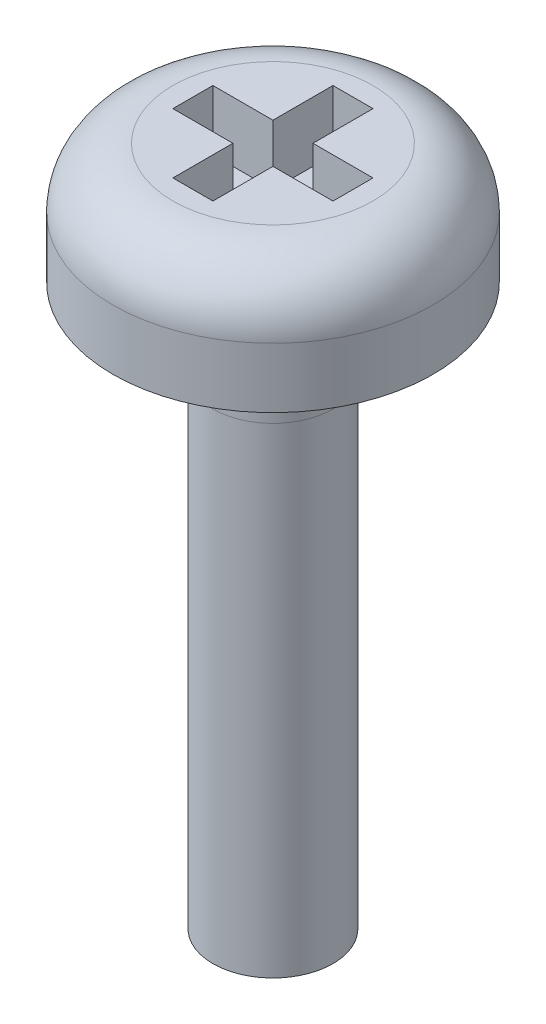
ISO-10303-21;
HEADER;
FILE_DESCRIPTION(('STEP AP214'),'2;1');
FILE_NAME('part.step','',(''),(''),'','','');
FILE_SCHEMA(('AUTOMOTIVE_DESIGN { 1 0 10303 214 1 1 1 1 }'));
ENDSEC;
DATA;
#1=APPLICATION_CONTEXT('core data for automotive mechanical design processes');
#2=APPLICATION_PROTOCOL_DEFINITION('international standard','automotive_design',2000,#1);
#3=PRODUCT_CONTEXT('',#1,'mechanical');
#4=PRODUCT('Part','Part','',(#3));
#5=PRODUCT_RELATED_PRODUCT_CATEGORY('part','',(#4));
#6=PRODUCT_DEFINITION_FORMATION('','',#4);
#7=PRODUCT_DEFINITION_CONTEXT('part definition',#1,'design');
#8=PRODUCT_DEFINITION('design','',#6,#7);
#9=PRODUCT_DEFINITION_SHAPE('','',#8);
#10=(LENGTH_UNIT() NAMED_UNIT(*) SI_UNIT(.MILLI.,.METRE.));
#11=(NAMED_UNIT(*) PLANE_ANGLE_UNIT() SI_UNIT($,.RADIAN.));
#12=(NAMED_UNIT(*) SI_UNIT($,.STERADIAN.) SOLID_ANGLE_UNIT());
#13=UNCERTAINTY_MEASURE_WITH_UNIT(LENGTH_MEASURE(1.E-05),#10,'distance_accuracy_value','');
#14=(GEOMETRIC_REPRESENTATION_CONTEXT(3) GLOBAL_UNCERTAINTY_ASSIGNED_CONTEXT((#13)) GLOBAL_UNIT_ASSIGNED_CONTEXT((#10,
#11,#12)) REPRESENTATION_CONTEXT('',''));
#15=CARTESIAN_POINT('',(0.,0.,0.));
#16=DIRECTION('',(0.,0.,1.));
#17=DIRECTION('',(1.,0.,0.));
#18=AXIS2_PLACEMENT_3D('',#15,#16,#17);
#19=CARTESIAN_POINT('',(0.,7.,0.));
#20=DIRECTION('',(0.,-1.,0.));
#21=DIRECTION('',(0.,0.,-1.));
#22=AXIS2_PLACEMENT_3D('',#19,#20,#21);
#23=CYLINDRICAL_SURFACE('',#22,0.75);
#24=CARTESIAN_POINT('',(0.,0.,0.));
#25=DIRECTION('',(0.,1.,0.));
#26=DIRECTION('',(0.,0.,1.));
#27=AXIS2_PLACEMENT_3D('',#24,#25,#26);
#28=CIRCLE('',#27,0.75);
#29=CARTESIAN_POINT('',(0.,0.,0.75));
#30=VERTEX_POINT('',#29);
#31=EDGE_CURVE('E214',#30,#30,#28,.T.);
#32=ORIENTED_EDGE('',*,*,#31,.T.);
#33=EDGE_LOOP('',(#32));
#34=FACE_BOUND('',#33,.T.);
#35=CARTESIAN_POINT('',(0.,6.,0.));
#36=DIRECTION('',(0.,1.,0.));
#37=DIRECTION('',(0.,0.,1.));
#38=AXIS2_PLACEMENT_3D('',#35,#36,#37);
#39=CIRCLE('',#38,0.75);
#40=CARTESIAN_POINT('',(0.,6.,0.75));
#41=VERTEX_POINT('',#40);
#42=EDGE_CURVE('E11',#41,#41,#39,.T.);
#43=ORIENTED_EDGE('',*,*,#42,.F.);
#44=EDGE_LOOP('',(#43));
#45=FACE_BOUND('',#44,.T.);
#46=ADVANCED_FACE('F37',(#34,#45),#23,.T.);
#47=ORIENTED_EDGE('',*,*,#42,.T.);
#48=EDGE_LOOP('',(#47));
#49=FACE_BOUND('',#48,.T.);
#50=CARTESIAN_POINT('',(0.,7.,0.));
#51=DIRECTION('',(0.,1.,0.));
#52=DIRECTION('',(0.,0.,1.));
#53=AXIS2_PLACEMENT_3D('',#50,#51,#52);
#54=CIRCLE('',#53,0.75);
#55=CARTESIAN_POINT('',(0.,7.,0.75));
#56=VERTEX_POINT('',#55);
#57=EDGE_CURVE('E215',#56,#56,#54,.T.);
#58=ORIENTED_EDGE('',*,*,#57,.F.);
#59=EDGE_LOOP('',(#58));
#60=FACE_BOUND('',#59,.T.);
#61=ADVANCED_FACE('F248',(#49,#60),#23,.T.);
#62=CARTESIAN_POINT('',(0.,0.,0.));
#63=DIRECTION('',(0.,1.,0.));
#64=DIRECTION('',(0.,0.,1.));
#65=AXIS2_PLACEMENT_3D('',#62,#63,#64);
#66=PLANE('',#65);
#67=ORIENTED_EDGE('',*,*,#31,.F.);
#68=EDGE_LOOP('',(#67));
#69=FACE_BOUND('',#68,.T.);
#70=ADVANCED_FACE('F244',(#69),#66,.F.);
#71=CARTESIAN_POINT('',(0.,8.5,0.));
#72=DIRECTION('',(0.,-1.,0.));
#73=DIRECTION('',(0.,0.,-1.));
#74=AXIS2_PLACEMENT_3D('',#71,#72,#73);
#75=CYLINDRICAL_SURFACE('',#74,2.);
#76=CARTESIAN_POINT('',(0.,7.75,0.));
#77=DIRECTION('',(0.,1.,0.));
#78=DIRECTION('',(0.,0.,1.));
#79=AXIS2_PLACEMENT_3D('',#76,#77,#78);
#80=CIRCLE('',#79,2.);
#81=CARTESIAN_POINT('',(0.,7.75,2.));
#82=VERTEX_POINT('',#81);
#83=EDGE_CURVE('E46',#82,#82,#80,.F.);
#84=ORIENTED_EDGE('',*,*,#83,.T.);
#85=EDGE_LOOP('',(#84));
#86=FACE_BOUND('',#85,.T.);
#87=CARTESIAN_POINT('',(0.,7.,0.));
#88=DIRECTION('',(0.,1.,0.));
#89=DIRECTION('',(0.,0.,1.));
#90=AXIS2_PLACEMENT_3D('',#87,#88,#89);
#91=CIRCLE('',#90,2.);
#92=CARTESIAN_POINT('',(0.,7.,2.));
#93=VERTEX_POINT('',#92);
#94=EDGE_CURVE('E194',#93,#93,#91,.T.);
#95=ORIENTED_EDGE('',*,*,#94,.T.);
#96=EDGE_LOOP('',(#95));
#97=FACE_BOUND('',#96,.T.);
#98=ADVANCED_FACE('F225',(#86,#97),#75,.T.);
#99=CARTESIAN_POINT('',(0.,8.5,0.));
#100=DIRECTION('',(0.,1.,0.));
#101=DIRECTION('',(0.,0.,1.));
#102=AXIS2_PLACEMENT_3D('',#99,#100,#101);
#103=PLANE('',#102);
#104=DIRECTION('',(0.,0.,-1.));
#105=VECTOR('',#104,1.);
#106=CARTESIAN_POINT('',(0.25,8.5,0.25));
#107=LINE('',#106,#105);
#108=CARTESIAN_POINT('',(0.25,8.5,1.));
#109=VERTEX_POINT('',#108);
#110=CARTESIAN_POINT('',(0.25,8.5,0.25));
#111=VERTEX_POINT('',#110);
#112=EDGE_CURVE('E53',#109,#111,#107,.T.);
#113=ORIENTED_EDGE('',*,*,#112,.F.);
#114=DIRECTION('',(1.,0.,0.));
#115=VECTOR('',#114,1.);
#116=CARTESIAN_POINT('',(-0.25,8.5,1.));
#117=LINE('',#116,#115);
#118=CARTESIAN_POINT('',(-0.25,8.5,1.));
#119=VERTEX_POINT('',#118);
#120=EDGE_CURVE('E190',#119,#109,#117,.T.);
#121=ORIENTED_EDGE('',*,*,#120,.F.);
#122=DIRECTION('',(0.,0.,1.));
#123=VECTOR('',#122,1.);
#124=CARTESIAN_POINT('',(-0.25,8.5,0.25));
#125=LINE('',#124,#123);
#126=CARTESIAN_POINT('',(-0.25,8.5,0.25));
#127=VERTEX_POINT('',#126);
#128=EDGE_CURVE('E188',#127,#119,#125,.T.);
#129=ORIENTED_EDGE('',*,*,#128,.F.);
#130=DIRECTION('',(1.,0.,0.));
#131=VECTOR('',#130,1.);
#132=CARTESIAN_POINT('',(-1.,8.5,0.25));
#133=LINE('',#132,#131);
#134=CARTESIAN_POINT('',(-1.,8.5,0.25));
#135=VERTEX_POINT('',#134);
#136=EDGE_CURVE('E137',#135,#127,#133,.T.);
#137=ORIENTED_EDGE('',*,*,#136,.F.);
#138=DIRECTION('',(0.,0.,1.));
#139=VECTOR('',#138,1.);
#140=CARTESIAN_POINT('',(-1.,8.5,-0.25));
#141=LINE('',#140,#139);
#142=CARTESIAN_POINT('',(-1.,8.5,-0.25));
#143=VERTEX_POINT('',#142);
#144=EDGE_CURVE('E184',#143,#135,#141,.T.);
#145=ORIENTED_EDGE('',*,*,#144,.F.);
#146=DIRECTION('',(-1.,0.,0.));
#147=VECTOR('',#146,1.);
#148=CARTESIAN_POINT('',(-1.,8.5,-0.25));
#149=LINE('',#148,#147);
#150=CARTESIAN_POINT('',(-0.25,8.5,-0.25));
#151=VERTEX_POINT('',#150);
#152=EDGE_CURVE('E181',#151,#143,#149,.T.);
#153=ORIENTED_EDGE('',*,*,#152,.F.);
#154=DIRECTION('',(0.,0.,1.));
#155=VECTOR('',#154,1.);
#156=CARTESIAN_POINT('',(-0.25,8.5,-1.));
#157=LINE('',#156,#155);
#158=CARTESIAN_POINT('',(-0.25,8.5,-1.));
#159=VERTEX_POINT('',#158);
#160=EDGE_CURVE('E178',#159,#151,#157,.T.);
#161=ORIENTED_EDGE('',*,*,#160,.F.);
#162=DIRECTION('',(-1.,0.,0.));
#163=VECTOR('',#162,1.);
#164=CARTESIAN_POINT('',(-0.25,8.5,-1.));
#165=LINE('',#164,#163);
#166=CARTESIAN_POINT('',(0.25,8.5,-1.));
#167=VERTEX_POINT('',#166);
#168=EDGE_CURVE('E175',#167,#159,#165,.T.);
#169=ORIENTED_EDGE('',*,*,#168,.F.);
#170=DIRECTION('',(0.,0.,-1.));
#171=VECTOR('',#170,1.);
#172=CARTESIAN_POINT('',(0.25,8.5,-1.));
#173=LINE('',#172,#171);
#174=CARTESIAN_POINT('',(0.25,8.5,-0.25));
#175=VERTEX_POINT('',#174);
#176=EDGE_CURVE('E172',#175,#167,#173,.T.);
#177=ORIENTED_EDGE('',*,*,#176,.F.);
#178=DIRECTION('',(-1.,0.,0.));
#179=VECTOR('',#178,1.);
#180=CARTESIAN_POINT('',(0.25,8.5,-0.25));
#181=LINE('',#180,#179);
#182=CARTESIAN_POINT('',(1.,8.5,-0.25));
#183=VERTEX_POINT('',#182);
#184=EDGE_CURVE('E169',#183,#175,#181,.T.);
#185=ORIENTED_EDGE('',*,*,#184,.F.);
#186=DIRECTION('',(0.,0.,-1.));
#187=VECTOR('',#186,1.);
#188=CARTESIAN_POINT('',(1.,8.5,-0.25));
#189=LINE('',#188,#187);
#190=CARTESIAN_POINT('',(1.,8.5,0.25));
#191=VERTEX_POINT('',#190);
#192=EDGE_CURVE('E166',#191,#183,#189,.T.);
#193=ORIENTED_EDGE('',*,*,#192,.F.);
#194=DIRECTION('',(1.,0.,0.));
#195=VECTOR('',#194,1.);
#196=CARTESIAN_POINT('',(0.25,8.5,0.25));
#197=LINE('',#196,#195);
#198=EDGE_CURVE('E163',#111,#191,#197,.T.);
#199=ORIENTED_EDGE('',*,*,#198,.F.);
#200=EDGE_LOOP('',(#113,#121,#129,#137,#145,#153,#161,#169,#177,#185,#193,#199));
#201=FACE_BOUND('',#200,.T.);
#202=CARTESIAN_POINT('',(0.,8.5,0.));
#203=DIRECTION('',(0.,1.,0.));
#204=DIRECTION('',(0.,0.,1.));
#205=AXIS2_PLACEMENT_3D('',#202,#203,#204);
#206=CIRCLE('',#205,1.25);
#207=CARTESIAN_POINT('',(0.,8.5,1.25));
#208=VERTEX_POINT('',#207);
#209=EDGE_CURVE('E218',#208,#208,#206,.T.);
#210=ORIENTED_EDGE('',*,*,#209,.T.);
#211=EDGE_LOOP('',(#210));
#212=FACE_BOUND('',#211,.T.);
#213=ADVANCED_FACE('F234',(#201,#212),#103,.T.);
#214=CARTESIAN_POINT('',(0.,7.,0.));
#215=DIRECTION('',(0.,1.,0.));
#216=DIRECTION('',(0.,0.,1.));
#217=AXIS2_PLACEMENT_3D('',#214,#215,#216);
#218=PLANE('',#217);
#219=ORIENTED_EDGE('',*,*,#57,.T.);
#220=EDGE_LOOP('',(#219));
#221=FACE_BOUND('',#220,.T.);
#222=ORIENTED_EDGE('',*,*,#94,.F.);
#223=EDGE_LOOP('',(#222));
#224=FACE_BOUND('',#223,.T.);
#225=ADVANCED_FACE('F231',(#221,#224),#218,.F.);
#226=CARTESIAN_POINT('',(0.,7.75,0.));
#227=DIRECTION('',(0.,1.,0.));
#228=DIRECTION('',(0.,0.,1.));
#229=AXIS2_PLACEMENT_3D('',#226,#227,#228);
#230=TOROIDAL_SURFACE('',#229,1.25,0.75);
#231=ORIENTED_EDGE('',*,*,#83,.F.);
#232=EDGE_LOOP('',(#231));
#233=FACE_BOUND('',#232,.T.);
#234=ORIENTED_EDGE('',*,*,#209,.F.);
#235=EDGE_LOOP('',(#234));
#236=FACE_BOUND('',#235,.T.);
#237=ADVANCED_FACE('F39',(#233,#236),#230,.T.);
#238=CARTESIAN_POINT('',(0.25,7.75,0.25));
#239=DIRECTION('',(1.,0.,0.));
#240=DIRECTION('',(0.,0.,-1.));
#241=AXIS2_PLACEMENT_3D('',#238,#239,#240);
#242=PLANE('',#241);
#243=ORIENTED_EDGE('',*,*,#112,.T.);
#244=DIRECTION('',(0.,1.,0.));
#245=VECTOR('',#244,1.);
#246=CARTESIAN_POINT('',(0.25,7.75,0.25));
#247=LINE('',#246,#245);
#248=CARTESIAN_POINT('',(0.25,7.75,0.25));
#249=VERTEX_POINT('',#248);
#250=EDGE_CURVE('E101',#249,#111,#247,.T.);
#251=ORIENTED_EDGE('',*,*,#250,.F.);
#252=DIRECTION('',(0.,0.,-1.));
#253=VECTOR('',#252,1.);
#254=CARTESIAN_POINT('',(0.25,7.75,0.25));
#255=LINE('',#254,#253);
#256=CARTESIAN_POINT('',(0.25,7.75,1.));
#257=VERTEX_POINT('',#256);
#258=EDGE_CURVE('E192',#257,#249,#255,.T.);
#259=ORIENTED_EDGE('',*,*,#258,.F.);
#260=DIRECTION('',(0.,1.,0.));
#261=VECTOR('',#260,1.);
#262=CARTESIAN_POINT('',(0.25,7.75,1.));
#263=LINE('',#262,#261);
#264=EDGE_CURVE('E61',#257,#109,#263,.T.);
#265=ORIENTED_EDGE('',*,*,#264,.T.);
#266=EDGE_LOOP('',(#243,#251,#259,#265));
#267=FACE_BOUND('',#266,.T.);
#268=ADVANCED_FACE('F230',(#267),#242,.F.);
#269=CARTESIAN_POINT('',(-0.25,7.75,1.));
#270=DIRECTION('',(0.,0.,1.));
#271=DIRECTION('',(1.,0.,0.));
#272=AXIS2_PLACEMENT_3D('',#269,#270,#271);
#273=PLANE('',#272);
#274=ORIENTED_EDGE('',*,*,#120,.T.);
#275=ORIENTED_EDGE('',*,*,#264,.F.);
#276=DIRECTION('',(1.,0.,0.));
#277=VECTOR('',#276,1.);
#278=CARTESIAN_POINT('',(-0.25,7.75,1.));
#279=LINE('',#278,#277);
#280=CARTESIAN_POINT('',(-0.25,7.75,1.));
#281=VERTEX_POINT('',#280);
#282=EDGE_CURVE('E149',#281,#257,#279,.T.);
#283=ORIENTED_EDGE('',*,*,#282,.F.);
#284=DIRECTION('',(0.,1.,0.));
#285=VECTOR('',#284,1.);
#286=CARTESIAN_POINT('',(-0.25,7.75,1.));
#287=LINE('',#286,#285);
#288=EDGE_CURVE('E141',#281,#119,#287,.T.);
#289=ORIENTED_EDGE('',*,*,#288,.T.);
#290=EDGE_LOOP('',(#274,#275,#283,#289));
#291=FACE_BOUND('',#290,.T.);
#292=ADVANCED_FACE('F289',(#291),#273,.F.);
#293=CARTESIAN_POINT('',(-0.25,7.75,0.25));
#294=DIRECTION('',(-1.,0.,0.));
#295=DIRECTION('',(0.,0.,1.));
#296=AXIS2_PLACEMENT_3D('',#293,#294,#295);
#297=PLANE('',#296);
#298=ORIENTED_EDGE('',*,*,#128,.T.);
#299=ORIENTED_EDGE('',*,*,#288,.F.);
#300=DIRECTION('',(0.,0.,1.));
#301=VECTOR('',#300,1.);
#302=CARTESIAN_POINT('',(-0.25,7.75,0.25));
#303=LINE('',#302,#301);
#304=CARTESIAN_POINT('',(-0.25,7.75,0.25));
#305=VERTEX_POINT('',#304);
#306=EDGE_CURVE('E145',#305,#281,#303,.T.);
#307=ORIENTED_EDGE('',*,*,#306,.F.);
#308=DIRECTION('',(0.,1.,0.));
#309=VECTOR('',#308,1.);
#310=CARTESIAN_POINT('',(-0.25,7.75,0.25));
#311=LINE('',#310,#309);
#312=EDGE_CURVE('E130',#305,#127,#311,.T.);
#313=ORIENTED_EDGE('',*,*,#312,.T.);
#314=EDGE_LOOP('',(#298,#299,#307,#313));
#315=FACE_BOUND('',#314,.T.);
#316=ADVANCED_FACE('F146',(#315),#297,.F.);
#317=CARTESIAN_POINT('',(-1.,7.75,0.25));
#318=DIRECTION('',(0.,0.,1.));
#319=DIRECTION('',(1.,0.,0.));
#320=AXIS2_PLACEMENT_3D('',#317,#318,#319);
#321=PLANE('',#320);
#322=ORIENTED_EDGE('',*,*,#136,.T.);
#323=ORIENTED_EDGE('',*,*,#312,.F.);
#324=DIRECTION('',(1.,0.,0.));
#325=VECTOR('',#324,1.);
#326=CARTESIAN_POINT('',(-1.,7.75,0.25));
#327=LINE('',#326,#325);
#328=CARTESIAN_POINT('',(-1.,7.75,0.25));
#329=VERTEX_POINT('',#328);
#330=EDGE_CURVE('E134',#329,#305,#327,.T.);
#331=ORIENTED_EDGE('',*,*,#330,.F.);
#332=DIRECTION('',(0.,1.,0.));
#333=VECTOR('',#332,1.);
#334=CARTESIAN_POINT('',(-1.,7.75,0.25));
#335=LINE('',#334,#333);
#336=EDGE_CURVE('E142',#329,#135,#335,.T.);
#337=ORIENTED_EDGE('',*,*,#336,.T.);
#338=EDGE_LOOP('',(#322,#323,#331,#337));
#339=FACE_BOUND('',#338,.T.);
#340=ADVANCED_FACE('F132',(#339),#321,.F.);
#341=CARTESIAN_POINT('',(-1.,7.75,-0.25));
#342=DIRECTION('',(-1.,0.,0.));
#343=DIRECTION('',(0.,0.,1.));
#344=AXIS2_PLACEMENT_3D('',#341,#342,#343);
#345=PLANE('',#344);
#346=ORIENTED_EDGE('',*,*,#144,.T.);
#347=ORIENTED_EDGE('',*,*,#336,.F.);
#348=DIRECTION('',(0.,0.,1.));
#349=VECTOR('',#348,1.);
#350=CARTESIAN_POINT('',(-1.,7.75,-0.25));
#351=LINE('',#350,#349);
#352=CARTESIAN_POINT('',(-1.,7.75,-0.25));
#353=VERTEX_POINT('',#352);
#354=EDGE_CURVE('E155',#353,#329,#351,.T.);
#355=ORIENTED_EDGE('',*,*,#354,.F.);
#356=DIRECTION('',(0.,1.,0.));
#357=VECTOR('',#356,1.);
#358=CARTESIAN_POINT('',(-1.,7.75,-0.25));
#359=LINE('',#358,#357);
#360=EDGE_CURVE('E197',#353,#143,#359,.T.);
#361=ORIENTED_EDGE('',*,*,#360,.T.);
#362=EDGE_LOOP('',(#346,#347,#355,#361));
#363=FACE_BOUND('',#362,.T.);
#364=ADVANCED_FACE('F313',(#363),#345,.F.);
#365=CARTESIAN_POINT('',(-1.,7.75,-0.25));
#366=DIRECTION('',(0.,0.,-1.));
#367=DIRECTION('',(-1.,0.,0.));
#368=AXIS2_PLACEMENT_3D('',#365,#366,#367);
#369=PLANE('',#368);
#370=ORIENTED_EDGE('',*,*,#152,.T.);
#371=ORIENTED_EDGE('',*,*,#360,.F.);
#372=DIRECTION('',(-1.,0.,0.));
#373=VECTOR('',#372,1.);
#374=CARTESIAN_POINT('',(-1.,7.75,-0.25));
#375=LINE('',#374,#373);
#376=CARTESIAN_POINT('',(-0.25,7.75,-0.25));
#377=VERTEX_POINT('',#376);
#378=EDGE_CURVE('E157',#377,#353,#375,.T.);
#379=ORIENTED_EDGE('',*,*,#378,.F.);
#380=DIRECTION('',(0.,1.,0.));
#381=VECTOR('',#380,1.);
#382=CARTESIAN_POINT('',(-0.25,7.75,-0.25));
#383=LINE('',#382,#381);
#384=EDGE_CURVE('E199',#377,#151,#383,.T.);
#385=ORIENTED_EDGE('',*,*,#384,.T.);
#386=EDGE_LOOP('',(#370,#371,#379,#385));
#387=FACE_BOUND('',#386,.T.);
#388=ADVANCED_FACE('F322',(#387),#369,.F.);
#389=CARTESIAN_POINT('',(-0.25,7.75,-1.));
#390=DIRECTION('',(-1.,0.,0.));
#391=DIRECTION('',(0.,0.,1.));
#392=AXIS2_PLACEMENT_3D('',#389,#390,#391);
#393=PLANE('',#392);
#394=ORIENTED_EDGE('',*,*,#160,.T.);
#395=ORIENTED_EDGE('',*,*,#384,.F.);
#396=DIRECTION('',(0.,0.,1.));
#397=VECTOR('',#396,1.);
#398=CARTESIAN_POINT('',(-0.25,7.75,-1.));
#399=LINE('',#398,#397);
#400=CARTESIAN_POINT('',(-0.25,7.75,-1.));
#401=VERTEX_POINT('',#400);
#402=EDGE_CURVE('E443',#401,#377,#399,.T.);
#403=ORIENTED_EDGE('',*,*,#402,.F.);
#404=DIRECTION('',(0.,1.,0.));
#405=VECTOR('',#404,1.);
#406=CARTESIAN_POINT('',(-0.25,7.75,-1.));
#407=LINE('',#406,#405);
#408=EDGE_CURVE('E201',#401,#159,#407,.T.);
#409=ORIENTED_EDGE('',*,*,#408,.T.);
#410=EDGE_LOOP('',(#394,#395,#403,#409));
#411=FACE_BOUND('',#410,.T.);
#412=ADVANCED_FACE('F332',(#411),#393,.F.);
#413=CARTESIAN_POINT('',(-0.25,7.75,-1.));
#414=DIRECTION('',(0.,0.,-1.));
#415=DIRECTION('',(-1.,0.,0.));
#416=AXIS2_PLACEMENT_3D('',#413,#414,#415);
#417=PLANE('',#416);
#418=ORIENTED_EDGE('',*,*,#168,.T.);
#419=ORIENTED_EDGE('',*,*,#408,.F.);
#420=DIRECTION('',(-1.,0.,0.));
#421=VECTOR('',#420,1.);
#422=CARTESIAN_POINT('',(-0.25,7.75,-1.));
#423=LINE('',#422,#421);
#424=CARTESIAN_POINT('',(0.25,7.75,-1.));
#425=VERTEX_POINT('',#424);
#426=EDGE_CURVE('E440',#425,#401,#423,.T.);
#427=ORIENTED_EDGE('',*,*,#426,.F.);
#428=DIRECTION('',(0.,1.,0.));
#429=VECTOR('',#428,1.);
#430=CARTESIAN_POINT('',(0.25,7.75,-1.));
#431=LINE('',#430,#429);
#432=EDGE_CURVE('E203',#425,#167,#431,.T.);
#433=ORIENTED_EDGE('',*,*,#432,.T.);
#434=EDGE_LOOP('',(#418,#419,#427,#433));
#435=FACE_BOUND('',#434,.T.);
#436=ADVANCED_FACE('F342',(#435),#417,.F.);
#437=CARTESIAN_POINT('',(0.25,7.75,-1.));
#438=DIRECTION('',(1.,0.,0.));
#439=DIRECTION('',(0.,0.,-1.));
#440=AXIS2_PLACEMENT_3D('',#437,#438,#439);
#441=PLANE('',#440);
#442=ORIENTED_EDGE('',*,*,#176,.T.);
#443=ORIENTED_EDGE('',*,*,#432,.F.);
#444=DIRECTION('',(0.,0.,-1.));
#445=VECTOR('',#444,1.);
#446=CARTESIAN_POINT('',(0.25,7.75,-1.));
#447=LINE('',#446,#445);
#448=CARTESIAN_POINT('',(0.25,7.75,-0.25));
#449=VERTEX_POINT('',#448);
#450=EDGE_CURVE('E437',#449,#425,#447,.T.);
#451=ORIENTED_EDGE('',*,*,#450,.F.);
#452=DIRECTION('',(0.,1.,0.));
#453=VECTOR('',#452,1.);
#454=CARTESIAN_POINT('',(0.25,7.75,-0.25));
#455=LINE('',#454,#453);
#456=EDGE_CURVE('E205',#449,#175,#455,.T.);
#457=ORIENTED_EDGE('',*,*,#456,.T.);
#458=EDGE_LOOP('',(#442,#443,#451,#457));
#459=FACE_BOUND('',#458,.T.);
#460=ADVANCED_FACE('F352',(#459),#441,.F.);
#461=CARTESIAN_POINT('',(0.25,7.75,-0.25));
#462=DIRECTION('',(0.,0.,-1.));
#463=DIRECTION('',(-1.,0.,0.));
#464=AXIS2_PLACEMENT_3D('',#461,#462,#463);
#465=PLANE('',#464);
#466=ORIENTED_EDGE('',*,*,#184,.T.);
#467=ORIENTED_EDGE('',*,*,#456,.F.);
#468=DIRECTION('',(-1.,0.,0.));
#469=VECTOR('',#468,1.);
#470=CARTESIAN_POINT('',(0.25,7.75,-0.25));
#471=LINE('',#470,#469);
#472=CARTESIAN_POINT('',(1.,7.75,-0.25));
#473=VERTEX_POINT('',#472);
#474=EDGE_CURVE('E430',#473,#449,#471,.T.);
#475=ORIENTED_EDGE('',*,*,#474,.F.);
#476=DIRECTION('',(0.,1.,0.));
#477=VECTOR('',#476,1.);
#478=CARTESIAN_POINT('',(1.,7.75,-0.25));
#479=LINE('',#478,#477);
#480=EDGE_CURVE('E207',#473,#183,#479,.T.);
#481=ORIENTED_EDGE('',*,*,#480,.T.);
#482=EDGE_LOOP('',(#466,#467,#475,#481));
#483=FACE_BOUND('',#482,.T.);
#484=ADVANCED_FACE('F362',(#483),#465,.F.);
#485=CARTESIAN_POINT('',(1.,7.75,-0.25));
#486=DIRECTION('',(1.,0.,0.));
#487=DIRECTION('',(0.,0.,-1.));
#488=AXIS2_PLACEMENT_3D('',#485,#486,#487);
#489=PLANE('',#488);
#490=ORIENTED_EDGE('',*,*,#192,.T.);
#491=ORIENTED_EDGE('',*,*,#480,.F.);
#492=DIRECTION('',(0.,0.,-1.));
#493=VECTOR('',#492,1.);
#494=CARTESIAN_POINT('',(1.,7.75,-0.25));
#495=LINE('',#494,#493);
#496=CARTESIAN_POINT('',(1.,7.75,0.25));
#497=VERTEX_POINT('',#496);
#498=EDGE_CURVE('E427',#497,#473,#495,.T.);
#499=ORIENTED_EDGE('',*,*,#498,.F.);
#500=DIRECTION('',(0.,1.,0.));
#501=VECTOR('',#500,1.);
#502=CARTESIAN_POINT('',(1.,7.75,0.25));
#503=LINE('',#502,#501);
#504=EDGE_CURVE('E209',#497,#191,#503,.T.);
#505=ORIENTED_EDGE('',*,*,#504,.T.);
#506=EDGE_LOOP('',(#490,#491,#499,#505));
#507=FACE_BOUND('',#506,.T.);
#508=ADVANCED_FACE('F372',(#507),#489,.F.);
#509=CARTESIAN_POINT('',(0.25,7.75,0.25));
#510=DIRECTION('',(0.,0.,1.));
#511=DIRECTION('',(1.,0.,0.));
#512=AXIS2_PLACEMENT_3D('',#509,#510,#511);
#513=PLANE('',#512);
#514=ORIENTED_EDGE('',*,*,#198,.T.);
#515=ORIENTED_EDGE('',*,*,#504,.F.);
#516=DIRECTION('',(1.,0.,0.));
#517=VECTOR('',#516,1.);
#518=CARTESIAN_POINT('',(0.25,7.75,0.25));
#519=LINE('',#518,#517);
#520=EDGE_CURVE('E431',#249,#497,#519,.T.);
#521=ORIENTED_EDGE('',*,*,#520,.F.);
#522=ORIENTED_EDGE('',*,*,#250,.T.);
#523=EDGE_LOOP('',(#514,#515,#521,#522));
#524=FACE_BOUND('',#523,.T.);
#525=ADVANCED_FACE('F382',(#524),#513,.F.);
#526=CARTESIAN_POINT('',(0.,7.75,0.));
#527=DIRECTION('',(0.,1.,0.));
#528=DIRECTION('',(0.,0.,1.));
#529=AXIS2_PLACEMENT_3D('',#526,#527,#528);
#530=PLANE('',#529);
#531=ORIENTED_EDGE('',*,*,#258,.T.);
#532=ORIENTED_EDGE('',*,*,#520,.T.);
#533=ORIENTED_EDGE('',*,*,#498,.T.);
#534=ORIENTED_EDGE('',*,*,#474,.T.);
#535=ORIENTED_EDGE('',*,*,#450,.T.);
#536=ORIENTED_EDGE('',*,*,#426,.T.);
#537=ORIENTED_EDGE('',*,*,#402,.T.);
#538=ORIENTED_EDGE('',*,*,#378,.T.);
#539=ORIENTED_EDGE('',*,*,#354,.T.);
#540=ORIENTED_EDGE('',*,*,#330,.T.);
#541=ORIENTED_EDGE('',*,*,#306,.T.);
#542=ORIENTED_EDGE('',*,*,#282,.T.);
#543=EDGE_LOOP('',(#531,#532,#533,#534,#535,#536,#537,#538,#539,#540,#541,#542));
#544=FACE_BOUND('',#543,.T.);
#545=ADVANCED_FACE('F152',(#544),#530,.T.);
#546=CLOSED_SHELL('',(#46,#61,#70,#98,#213,#225,#237,#268,#292,#316,#340,#364,#388,#412,#436,
#460,#484,#508,#525,#545));
#547=MANIFOLD_SOLID_BREP('B2',#546);
#548=ADVANCED_BREP_SHAPE_REPRESENTATION('',(#18,#547),#14);
#549=SHAPE_DEFINITION_REPRESENTATION(#9,#548);
ENDSEC;
END-ISO-10303-21;
